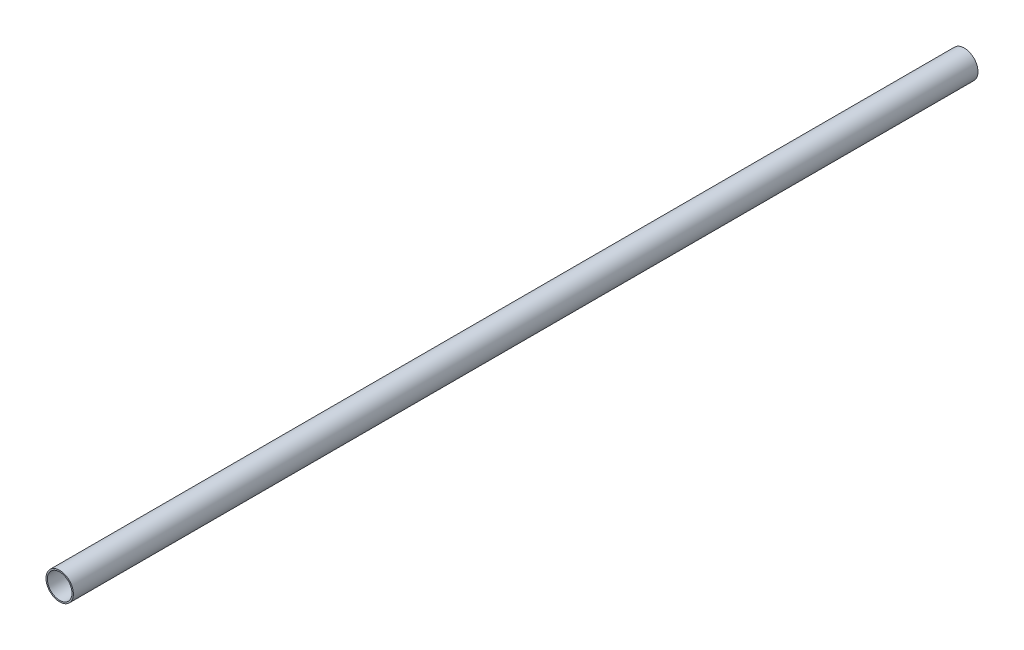
ISO-10303-21;
HEADER;
FILE_DESCRIPTION(('STEP AP214'),'2;1');
FILE_NAME('part.step','',(''),(''),'','','');
FILE_SCHEMA(('AUTOMOTIVE_DESIGN { 1 0 10303 214 1 1 1 1 }'));
ENDSEC;
DATA;
#1=APPLICATION_CONTEXT('core data for automotive mechanical design processes');
#2=APPLICATION_PROTOCOL_DEFINITION('international standard','automotive_design',2000,#1);
#3=PRODUCT_CONTEXT('',#1,'mechanical');
#4=PRODUCT('Part','Part','',(#3));
#5=PRODUCT_RELATED_PRODUCT_CATEGORY('part','',(#4));
#6=PRODUCT_DEFINITION_FORMATION('','',#4);
#7=PRODUCT_DEFINITION_CONTEXT('part definition',#1,'design');
#8=PRODUCT_DEFINITION('design','',#6,#7);
#9=PRODUCT_DEFINITION_SHAPE('','',#8);
#10=(LENGTH_UNIT() NAMED_UNIT(*) SI_UNIT(.MILLI.,.METRE.));
#11=(NAMED_UNIT(*) PLANE_ANGLE_UNIT() SI_UNIT($,.RADIAN.));
#12=(NAMED_UNIT(*) SI_UNIT($,.STERADIAN.) SOLID_ANGLE_UNIT());
#13=UNCERTAINTY_MEASURE_WITH_UNIT(LENGTH_MEASURE(1.E-05),#10,'distance_accuracy_value','');
#14=(GEOMETRIC_REPRESENTATION_CONTEXT(3) GLOBAL_UNCERTAINTY_ASSIGNED_CONTEXT((#13)) GLOBAL_UNIT_ASSIGNED_CONTEXT((#10,
#11,#12)) REPRESENTATION_CONTEXT('',''));
#15=CARTESIAN_POINT('',(0.,0.,0.));
#16=DIRECTION('',(0.,0.,1.));
#17=DIRECTION('',(1.,0.,0.));
#18=AXIS2_PLACEMENT_3D('',#15,#16,#17);
#19=CARTESIAN_POINT('',(0.,0.,330.));
#20=DIRECTION('',(0.,0.,1.));
#21=DIRECTION('',(1.,0.,0.));
#22=AXIS2_PLACEMENT_3D('',#19,#20,#21);
#23=PLANE('',#22);
#24=CARTESIAN_POINT('',(0.,0.,330.));
#25=DIRECTION('',(0.,0.,1.));
#26=DIRECTION('',(1.,0.,0.));
#27=AXIS2_PLACEMENT_3D('',#24,#25,#26);
#28=CIRCLE('',#27,5.);
#29=CARTESIAN_POINT('',(5.,0.,330.));
#30=VERTEX_POINT('',#29);
#31=EDGE_CURVE('E10',#30,#30,#28,.T.);
#32=ORIENTED_EDGE('',*,*,#31,.T.);
#33=EDGE_LOOP('',(#32));
#34=FACE_BOUND('',#33,.T.);
#35=CARTESIAN_POINT('',(0.,0.,330.));
#36=DIRECTION('',(0.,0.,1.));
#37=DIRECTION('',(1.,0.,0.));
#38=AXIS2_PLACEMENT_3D('',#35,#36,#37);
#39=CIRCLE('',#38,4.5);
#40=CARTESIAN_POINT('',(4.5,0.,330.));
#41=VERTEX_POINT('',#40);
#42=EDGE_CURVE('E41',#41,#41,#39,.T.);
#43=ORIENTED_EDGE('',*,*,#42,.F.);
#44=EDGE_LOOP('',(#43));
#45=FACE_BOUND('',#44,.T.);
#46=ADVANCED_FACE('F30',(#34,#45),#23,.T.);
#47=CARTESIAN_POINT('',(0.,0.,0.));
#48=DIRECTION('',(0.,0.,1.));
#49=DIRECTION('',(1.,0.,0.));
#50=AXIS2_PLACEMENT_3D('',#47,#48,#49);
#51=PLANE('',#50);
#52=CARTESIAN_POINT('',(0.,0.,0.));
#53=DIRECTION('',(0.,0.,1.));
#54=DIRECTION('',(1.,0.,0.));
#55=AXIS2_PLACEMENT_3D('',#52,#53,#54);
#56=CIRCLE('',#55,5.);
#57=CARTESIAN_POINT('',(5.,0.,0.));
#58=VERTEX_POINT('',#57);
#59=EDGE_CURVE('E34',#58,#58,#56,.T.);
#60=ORIENTED_EDGE('',*,*,#59,.F.);
#61=EDGE_LOOP('',(#60));
#62=FACE_BOUND('',#61,.T.);
#63=CARTESIAN_POINT('',(0.,0.,0.));
#64=DIRECTION('',(0.,0.,1.));
#65=DIRECTION('',(1.,0.,0.));
#66=AXIS2_PLACEMENT_3D('',#63,#64,#65);
#67=CIRCLE('',#66,4.5);
#68=CARTESIAN_POINT('',(4.5,0.,0.));
#69=VERTEX_POINT('',#68);
#70=EDGE_CURVE('E43',#69,#69,#67,.T.);
#71=ORIENTED_EDGE('',*,*,#70,.T.);
#72=EDGE_LOOP('',(#71));
#73=FACE_BOUND('',#72,.T.);
#74=ADVANCED_FACE('F53',(#62,#73),#51,.F.);
#75=CARTESIAN_POINT('',(0.,0.,330.));
#76=DIRECTION('',(0.,0.,-1.));
#77=DIRECTION('',(-1.,0.,0.));
#78=AXIS2_PLACEMENT_3D('',#75,#76,#77);
#79=CYLINDRICAL_SURFACE('',#78,5.);
#80=ORIENTED_EDGE('',*,*,#31,.F.);
#81=EDGE_LOOP('',(#80));
#82=FACE_BOUND('',#81,.T.);
#83=ORIENTED_EDGE('',*,*,#59,.T.);
#84=EDGE_LOOP('',(#83));
#85=FACE_BOUND('',#84,.T.);
#86=ADVANCED_FACE('F32',(#82,#85),#79,.T.);
#87=CARTESIAN_POINT('',(0.,0.,330.));
#88=DIRECTION('',(0.,0.,-1.));
#89=DIRECTION('',(-1.,0.,0.));
#90=AXIS2_PLACEMENT_3D('',#87,#88,#89);
#91=CYLINDRICAL_SURFACE('',#90,4.5);
#92=ORIENTED_EDGE('',*,*,#42,.T.);
#93=EDGE_LOOP('',(#92));
#94=FACE_BOUND('',#93,.T.);
#95=ORIENTED_EDGE('',*,*,#70,.F.);
#96=EDGE_LOOP('',(#95));
#97=FACE_BOUND('',#96,.T.);
#98=ADVANCED_FACE('F49',(#94,#97),#91,.F.);
#99=CLOSED_SHELL('',(#46,#74,#86,#98));
#100=MANIFOLD_SOLID_BREP('B2',#99);
#101=ADVANCED_BREP_SHAPE_REPRESENTATION('',(#18,#100),#14);
#102=SHAPE_DEFINITION_REPRESENTATION(#9,#101);
ENDSEC;
END-ISO-10303-21;
